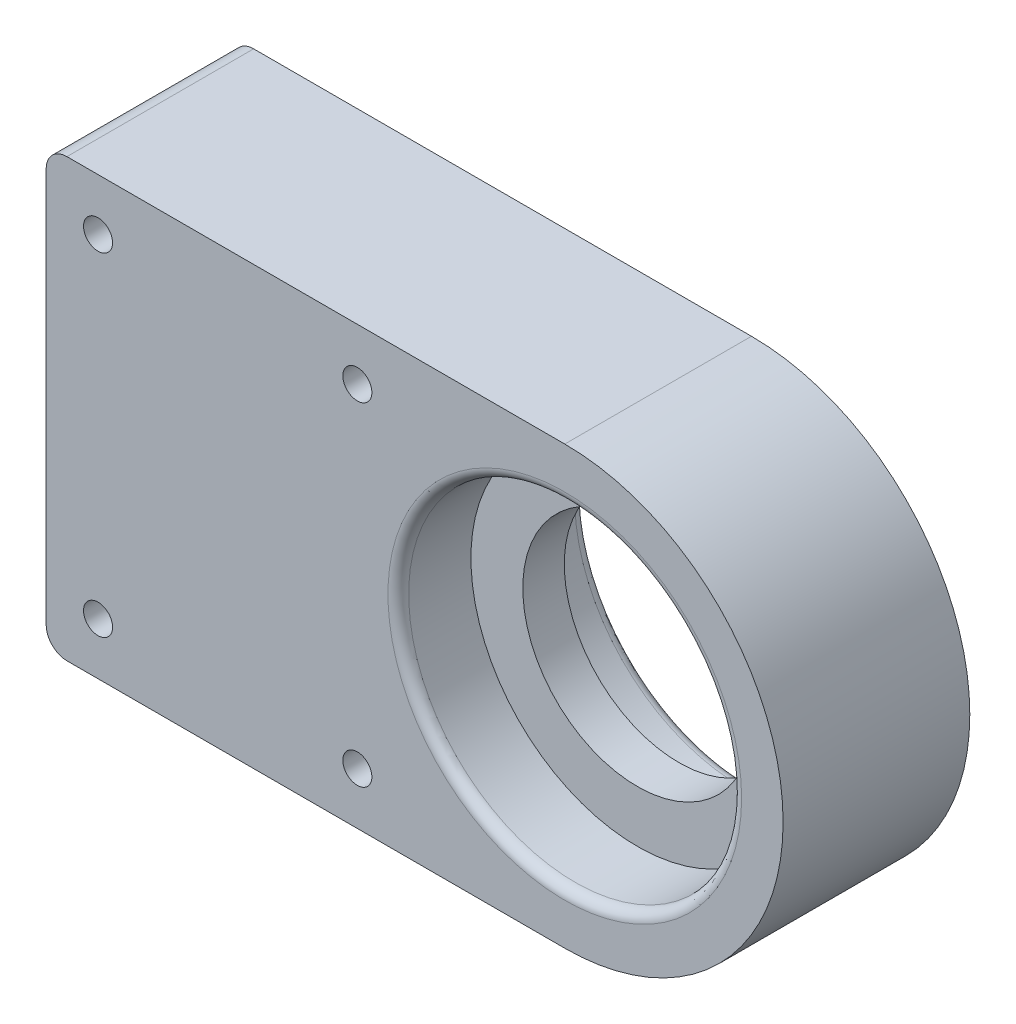
ISO-10303-21;
HEADER;
FILE_DESCRIPTION(('STEP AP214'),'2;1');
FILE_NAME('part.step','',(''),(''),'','','');
FILE_SCHEMA(('AUTOMOTIVE_DESIGN { 1 0 10303 214 1 1 1 1 }'));
ENDSEC;
DATA;
#1=APPLICATION_CONTEXT('core data for automotive mechanical design processes');
#2=APPLICATION_PROTOCOL_DEFINITION('international standard','automotive_design',2000,#1);
#3=PRODUCT_CONTEXT('',#1,'mechanical');
#4=PRODUCT('Part','Part','',(#3));
#5=PRODUCT_RELATED_PRODUCT_CATEGORY('part','',(#4));
#6=PRODUCT_DEFINITION_FORMATION('','',#4);
#7=PRODUCT_DEFINITION_CONTEXT('part definition',#1,'design');
#8=PRODUCT_DEFINITION('design','',#6,#7);
#9=PRODUCT_DEFINITION_SHAPE('','',#8);
#10=(LENGTH_UNIT() NAMED_UNIT(*) SI_UNIT(.MILLI.,.METRE.));
#11=(NAMED_UNIT(*) PLANE_ANGLE_UNIT() SI_UNIT($,.RADIAN.));
#12=(NAMED_UNIT(*) SI_UNIT($,.STERADIAN.) SOLID_ANGLE_UNIT());
#13=UNCERTAINTY_MEASURE_WITH_UNIT(LENGTH_MEASURE(1.E-05),#10,'distance_accuracy_value','');
#14=(GEOMETRIC_REPRESENTATION_CONTEXT(3) GLOBAL_UNCERTAINTY_ASSIGNED_CONTEXT((#13)) GLOBAL_UNIT_ASSIGNED_CONTEXT((#10,
#11,#12)) REPRESENTATION_CONTEXT('',''));
#15=CARTESIAN_POINT('',(0.,0.,0.));
#16=DIRECTION('',(0.,0.,1.));
#17=DIRECTION('',(1.,0.,0.));
#18=AXIS2_PLACEMENT_3D('',#15,#16,#17);
#19=CARTESIAN_POINT('',(0.,0.,-9.));
#20=DIRECTION('',(0.,0.,1.));
#21=DIRECTION('',(1.,0.,0.));
#22=AXIS2_PLACEMENT_3D('',#19,#20,#21);
#23=CYLINDRICAL_SURFACE('',#22,16.05);
#24=CARTESIAN_POINT('',(0.,0.,-8.));
#25=DIRECTION('',(0.,0.,1.));
#26=DIRECTION('',(1.,0.,0.));
#27=AXIS2_PLACEMENT_3D('',#24,#25,#26);
#28=CIRCLE('',#27,16.05);
#29=CARTESIAN_POINT('',(16.05,0.,-8.));
#30=VERTEX_POINT('',#29);
#31=EDGE_CURVE('E158',#30,#30,#28,.F.);
#32=ORIENTED_EDGE('',*,*,#31,.T.);
#33=EDGE_LOOP('',(#32));
#34=FACE_BOUND('',#33,.T.);
#35=CARTESIAN_POINT('',(0.,0.,-2.));
#36=DIRECTION('',(0.,0.,1.));
#37=DIRECTION('',(1.,0.,0.));
#38=AXIS2_PLACEMENT_3D('',#35,#36,#37);
#39=CIRCLE('',#38,16.05);
#40=CARTESIAN_POINT('',(16.05,0.,-2.));
#41=VERTEX_POINT('',#40);
#42=EDGE_CURVE('E137',#41,#41,#39,.F.);
#43=ORIENTED_EDGE('',*,*,#42,.F.);
#44=EDGE_LOOP('',(#43));
#45=FACE_BOUND('',#44,.T.);
#46=ADVANCED_FACE('F39',(#34,#45),#23,.F.);
#47=CARTESIAN_POINT('',(0.,0.,-9.));
#48=DIRECTION('',(0.,0.,1.));
#49=DIRECTION('',(1.,0.,0.));
#50=AXIS2_PLACEMENT_3D('',#47,#48,#49);
#51=CYLINDRICAL_SURFACE('',#50,21.05);
#52=CARTESIAN_POINT('',(0.,0.,9.));
#53=DIRECTION('',(0.,0.,1.));
#54=DIRECTION('',(1.,0.,0.));
#55=AXIS2_PLACEMENT_3D('',#52,#53,#54);
#56=CIRCLE('',#55,21.05);
#57=CARTESIAN_POINT('',(0.,-21.05,9.));
#58=VERTEX_POINT('',#57);
#59=CARTESIAN_POINT('',(0.,21.05,9.));
#60=VERTEX_POINT('',#59);
#61=EDGE_CURVE('E100',#58,#60,#56,.T.);
#62=ORIENTED_EDGE('',*,*,#61,.F.);
#63=DIRECTION('',(0.,0.,1.));
#64=VECTOR('',#63,1.);
#65=CARTESIAN_POINT('',(0.,-21.05,-9.));
#66=LINE('',#65,#64);
#67=CARTESIAN_POINT('',(0.,-21.05,-9.));
#68=VERTEX_POINT('',#67);
#69=EDGE_CURVE('E104',#68,#58,#66,.T.);
#70=ORIENTED_EDGE('',*,*,#69,.F.);
#71=CARTESIAN_POINT('',(0.,0.,-9.));
#72=DIRECTION('',(0.,0.,1.));
#73=DIRECTION('',(1.,0.,0.));
#74=AXIS2_PLACEMENT_3D('',#71,#72,#73);
#75=CIRCLE('',#74,21.05);
#76=CARTESIAN_POINT('',(0.,21.05,-9.));
#77=VERTEX_POINT('',#76);
#78=EDGE_CURVE('E102',#68,#77,#75,.T.);
#79=ORIENTED_EDGE('',*,*,#78,.T.);
#80=DIRECTION('',(0.,0.,1.));
#81=VECTOR('',#80,1.);
#82=CARTESIAN_POINT('',(0.,21.05,-9.));
#83=LINE('',#82,#81);
#84=EDGE_CURVE('E95',#77,#60,#83,.T.);
#85=ORIENTED_EDGE('',*,*,#84,.T.);
#86=EDGE_LOOP('',(#62,#70,#79,#85));
#87=FACE_BOUND('',#86,.T.);
#88=ADVANCED_FACE('F97',(#87),#51,.T.);
#89=CARTESIAN_POINT('',(-50.,-21.05,-9.));
#90=DIRECTION('',(0.,-1.,0.));
#91=DIRECTION('',(1.,0.,0.));
#92=AXIS2_PLACEMENT_3D('',#89,#90,#91);
#93=PLANE('',#92);
#94=DIRECTION('',(1.,0.,0.));
#95=VECTOR('',#94,1.);
#96=CARTESIAN_POINT('',(-50.,-21.05,9.));
#97=LINE('',#96,#95);
#98=CARTESIAN_POINT('',(-48.,-21.05,9.));
#99=VERTEX_POINT('',#98);
#100=EDGE_CURVE('E118',#99,#58,#97,.T.);
#101=ORIENTED_EDGE('',*,*,#100,.F.);
#102=DIRECTION('',(0.,0.,1.));
#103=VECTOR('',#102,1.);
#104=CARTESIAN_POINT('',(-48.,-21.05,-9.));
#105=LINE('',#104,#103);
#106=CARTESIAN_POINT('',(-48.,-21.05,-9.));
#107=VERTEX_POINT('',#106);
#108=EDGE_CURVE('E62',#99,#107,#105,.F.);
#109=ORIENTED_EDGE('',*,*,#108,.T.);
#110=DIRECTION('',(1.,0.,0.));
#111=VECTOR('',#110,1.);
#112=CARTESIAN_POINT('',(-50.,-21.05,-9.));
#113=LINE('',#112,#111);
#114=EDGE_CURVE('E105',#107,#68,#113,.T.);
#115=ORIENTED_EDGE('',*,*,#114,.T.);
#116=ORIENTED_EDGE('',*,*,#69,.T.);
#117=EDGE_LOOP('',(#101,#109,#115,#116));
#118=FACE_BOUND('',#117,.T.);
#119=ADVANCED_FACE('F183',(#118),#93,.T.);
#120=CARTESIAN_POINT('',(-50.,21.05,-9.));
#121=DIRECTION('',(-1.,0.,0.));
#122=DIRECTION('',(0.,0.,1.));
#123=AXIS2_PLACEMENT_3D('',#120,#121,#122);
#124=PLANE('',#123);
#125=DIRECTION('',(0.,-1.,0.));
#126=VECTOR('',#125,1.);
#127=CARTESIAN_POINT('',(-50.,21.05,-9.));
#128=LINE('',#127,#126);
#129=CARTESIAN_POINT('',(-50.,19.05,-9.));
#130=VERTEX_POINT('',#129);
#131=CARTESIAN_POINT('',(-50.,-19.05,-9.));
#132=VERTEX_POINT('',#131);
#133=EDGE_CURVE('E133',#130,#132,#128,.T.);
#134=ORIENTED_EDGE('',*,*,#133,.T.);
#135=DIRECTION('',(0.,0.,1.));
#136=VECTOR('',#135,1.);
#137=CARTESIAN_POINT('',(-50.,-19.05,-9.));
#138=LINE('',#137,#136);
#139=CARTESIAN_POINT('',(-50.,-19.05,9.));
#140=VERTEX_POINT('',#139);
#141=EDGE_CURVE('E143',#132,#140,#138,.T.);
#142=ORIENTED_EDGE('',*,*,#141,.T.);
#143=DIRECTION('',(0.,-1.,0.));
#144=VECTOR('',#143,1.);
#145=CARTESIAN_POINT('',(-50.,21.05,9.));
#146=LINE('',#145,#144);
#147=CARTESIAN_POINT('',(-50.,19.05,9.));
#148=VERTEX_POINT('',#147);
#149=EDGE_CURVE('E114',#148,#140,#146,.T.);
#150=ORIENTED_EDGE('',*,*,#149,.F.);
#151=DIRECTION('',(0.,0.,1.));
#152=VECTOR('',#151,1.);
#153=CARTESIAN_POINT('',(-50.,19.05,-9.));
#154=LINE('',#153,#152);
#155=EDGE_CURVE('E140',#148,#130,#154,.F.);
#156=ORIENTED_EDGE('',*,*,#155,.T.);
#157=EDGE_LOOP('',(#134,#142,#150,#156));
#158=FACE_BOUND('',#157,.T.);
#159=ADVANCED_FACE('F199',(#158),#124,.T.);
#160=CARTESIAN_POINT('',(0.,21.05,-9.));
#161=DIRECTION('',(0.,1.,0.));
#162=DIRECTION('',(-1.,0.,0.));
#163=AXIS2_PLACEMENT_3D('',#160,#161,#162);
#164=PLANE('',#163);
#165=DIRECTION('',(-1.,0.,0.));
#166=VECTOR('',#165,1.);
#167=CARTESIAN_POINT('',(0.,21.05,-9.));
#168=LINE('',#167,#166);
#169=CARTESIAN_POINT('',(-48.,21.05,-9.));
#170=VERTEX_POINT('',#169);
#171=EDGE_CURVE('E131',#77,#170,#168,.T.);
#172=ORIENTED_EDGE('',*,*,#171,.T.);
#173=DIRECTION('',(0.,0.,1.));
#174=VECTOR('',#173,1.);
#175=CARTESIAN_POINT('',(-48.,21.05,-9.));
#176=LINE('',#175,#174);
#177=CARTESIAN_POINT('',(-48.,21.05,9.));
#178=VERTEX_POINT('',#177);
#179=EDGE_CURVE('E112',#170,#178,#176,.T.);
#180=ORIENTED_EDGE('',*,*,#179,.T.);
#181=DIRECTION('',(-1.,0.,0.));
#182=VECTOR('',#181,1.);
#183=CARTESIAN_POINT('',(0.,21.05,9.));
#184=LINE('',#183,#182);
#185=EDGE_CURVE('E109',#60,#178,#184,.T.);
#186=ORIENTED_EDGE('',*,*,#185,.F.);
#187=ORIENTED_EDGE('',*,*,#84,.F.);
#188=EDGE_LOOP('',(#172,#180,#186,#187));
#189=FACE_BOUND('',#188,.T.);
#190=ADVANCED_FACE('F110',(#189),#164,.T.);
#191=CARTESIAN_POINT('',(0.,0.,-9.));
#192=DIRECTION('',(0.,0.,1.));
#193=DIRECTION('',(1.,0.,0.));
#194=AXIS2_PLACEMENT_3D('',#191,#192,#193);
#195=PLANE('',#194);
#196=CARTESIAN_POINT('',(0.,0.,-9.));
#197=DIRECTION('',(0.,0.,1.));
#198=DIRECTION('',(1.,0.,0.));
#199=AXIS2_PLACEMENT_3D('',#196,#197,#198);
#200=CIRCLE('',#199,17.05);
#201=CARTESIAN_POINT('',(17.05,0.,-9.));
#202=VERTEX_POINT('',#201);
#203=EDGE_CURVE('E155',#202,#202,#200,.T.);
#204=ORIENTED_EDGE('',*,*,#203,.T.);
#205=EDGE_LOOP('',(#204));
#206=FACE_BOUND('',#205,.T.);
#207=CARTESIAN_POINT('',(-45.,-16.05,-9.));
#208=DIRECTION('',(0.,0.,1.));
#209=DIRECTION('',(1.,0.,0.));
#210=AXIS2_PLACEMENT_3D('',#207,#208,#209);
#211=CIRCLE('',#210,1.4);
#212=CARTESIAN_POINT('',(-43.6,-16.05,-9.));
#213=VERTEX_POINT('',#212);
#214=EDGE_CURVE('E403',#213,#213,#211,.T.);
#215=ORIENTED_EDGE('',*,*,#214,.T.);
#216=EDGE_LOOP('',(#215));
#217=FACE_BOUND('',#216,.T.);
#218=CARTESIAN_POINT('',(-20.,-16.05,-9.));
#219=DIRECTION('',(0.,0.,1.));
#220=DIRECTION('',(1.,0.,0.));
#221=AXIS2_PLACEMENT_3D('',#218,#219,#220);
#222=CIRCLE('',#221,1.4);
#223=CARTESIAN_POINT('',(-18.6,-16.05,-9.));
#224=VERTEX_POINT('',#223);
#225=EDGE_CURVE('E409',#224,#224,#222,.T.);
#226=ORIENTED_EDGE('',*,*,#225,.T.);
#227=EDGE_LOOP('',(#226));
#228=FACE_BOUND('',#227,.T.);
#229=CARTESIAN_POINT('',(-20.,16.05,-9.));
#230=DIRECTION('',(0.,0.,1.));
#231=DIRECTION('',(1.,0.,0.));
#232=AXIS2_PLACEMENT_3D('',#229,#230,#231);
#233=CIRCLE('',#232,1.4);
#234=CARTESIAN_POINT('',(-18.6,16.05,-9.));
#235=VERTEX_POINT('',#234);
#236=EDGE_CURVE('E415',#235,#235,#233,.T.);
#237=ORIENTED_EDGE('',*,*,#236,.T.);
#238=EDGE_LOOP('',(#237));
#239=FACE_BOUND('',#238,.T.);
#240=CARTESIAN_POINT('',(-45.,16.05,-9.));
#241=DIRECTION('',(0.,0.,1.));
#242=DIRECTION('',(1.,0.,0.));
#243=AXIS2_PLACEMENT_3D('',#240,#241,#242);
#244=CIRCLE('',#243,1.4);
#245=CARTESIAN_POINT('',(-43.6,16.05,-9.));
#246=VERTEX_POINT('',#245);
#247=EDGE_CURVE('E394',#246,#246,#244,.T.);
#248=ORIENTED_EDGE('',*,*,#247,.T.);
#249=EDGE_LOOP('',(#248));
#250=FACE_BOUND('',#249,.T.);
#251=ORIENTED_EDGE('',*,*,#114,.F.);
#252=CARTESIAN_POINT('',(-48.,-19.05,-9.));
#253=DIRECTION('',(0.,0.,1.));
#254=DIRECTION('',(1.,0.,0.));
#255=AXIS2_PLACEMENT_3D('',#252,#253,#254);
#256=CIRCLE('',#255,2.);
#257=EDGE_CURVE('E152',#107,#132,#256,.F.);
#258=ORIENTED_EDGE('',*,*,#257,.T.);
#259=ORIENTED_EDGE('',*,*,#133,.F.);
#260=CARTESIAN_POINT('',(-48.,19.05,-9.));
#261=DIRECTION('',(0.,0.,1.));
#262=DIRECTION('',(1.,0.,0.));
#263=AXIS2_PLACEMENT_3D('',#260,#261,#262);
#264=CIRCLE('',#263,2.);
#265=EDGE_CURVE('E54',#130,#170,#264,.F.);
#266=ORIENTED_EDGE('',*,*,#265,.T.);
#267=ORIENTED_EDGE('',*,*,#171,.F.);
#268=ORIENTED_EDGE('',*,*,#78,.F.);
#269=EDGE_LOOP('',(#251,#258,#259,#266,#267,#268));
#270=FACE_BOUND('',#269,.T.);
#271=ADVANCED_FACE('F189',(#206,#217,#228,#239,#250,#270),#195,.F.);
#272=CARTESIAN_POINT('',(0.,0.,8.));
#273=DIRECTION('',(0.,0.,1.));
#274=DIRECTION('',(1.,0.,0.));
#275=AXIS2_PLACEMENT_3D('',#272,#273,#274);
#276=CIRCLE('',#275,16.05);
#277=CARTESIAN_POINT('',(16.05,0.,8.));
#278=VERTEX_POINT('',#277);
#279=EDGE_CURVE('E47',#278,#278,#276,.T.);
#280=ORIENTED_EDGE('',*,*,#279,.T.);
#281=EDGE_LOOP('',(#280));
#282=FACE_BOUND('',#281,.T.);
#283=CARTESIAN_POINT('',(0.,0.,2.));
#284=DIRECTION('',(0.,0.,1.));
#285=DIRECTION('',(1.,0.,0.));
#286=AXIS2_PLACEMENT_3D('',#283,#284,#285);
#287=CIRCLE('',#286,16.05);
#288=CARTESIAN_POINT('',(16.05,0.,2.));
#289=VERTEX_POINT('',#288);
#290=EDGE_CURVE('E120',#289,#289,#287,.F.);
#291=ORIENTED_EDGE('',*,*,#290,.T.);
#292=EDGE_LOOP('',(#291));
#293=FACE_BOUND('',#292,.T.);
#294=ADVANCED_FACE('F163',(#282,#293),#23,.F.);
#295=CARTESIAN_POINT('',(0.,0.,9.));
#296=DIRECTION('',(0.,0.,1.));
#297=DIRECTION('',(1.,0.,0.));
#298=AXIS2_PLACEMENT_3D('',#295,#296,#297);
#299=PLANE('',#298);
#300=CARTESIAN_POINT('',(0.,0.,9.));
#301=DIRECTION('',(0.,0.,1.));
#302=DIRECTION('',(1.,0.,0.));
#303=AXIS2_PLACEMENT_3D('',#300,#301,#302);
#304=CIRCLE('',#303,17.05);
#305=CARTESIAN_POINT('',(17.05,0.,9.));
#306=VERTEX_POINT('',#305);
#307=EDGE_CURVE('E12',#306,#306,#304,.F.);
#308=ORIENTED_EDGE('',*,*,#307,.T.);
#309=EDGE_LOOP('',(#308));
#310=FACE_BOUND('',#309,.T.);
#311=CARTESIAN_POINT('',(-45.,-16.05,9.));
#312=DIRECTION('',(0.,0.,1.));
#313=DIRECTION('',(1.,0.,0.));
#314=AXIS2_PLACEMENT_3D('',#311,#312,#313);
#315=CIRCLE('',#314,1.4);
#316=CARTESIAN_POINT('',(-43.6,-16.05,9.));
#317=VERTEX_POINT('',#316);
#318=EDGE_CURVE('E406',#317,#317,#315,.T.);
#319=ORIENTED_EDGE('',*,*,#318,.F.);
#320=EDGE_LOOP('',(#319));
#321=FACE_BOUND('',#320,.T.);
#322=CARTESIAN_POINT('',(-20.,-16.05,9.));
#323=DIRECTION('',(0.,0.,1.));
#324=DIRECTION('',(1.,0.,0.));
#325=AXIS2_PLACEMENT_3D('',#322,#323,#324);
#326=CIRCLE('',#325,1.4);
#327=CARTESIAN_POINT('',(-18.6,-16.05,9.));
#328=VERTEX_POINT('',#327);
#329=EDGE_CURVE('E412',#328,#328,#326,.T.);
#330=ORIENTED_EDGE('',*,*,#329,.F.);
#331=EDGE_LOOP('',(#330));
#332=FACE_BOUND('',#331,.T.);
#333=CARTESIAN_POINT('',(-20.,16.05,9.));
#334=DIRECTION('',(0.,0.,1.));
#335=DIRECTION('',(1.,0.,0.));
#336=AXIS2_PLACEMENT_3D('',#333,#334,#335);
#337=CIRCLE('',#336,1.4);
#338=CARTESIAN_POINT('',(-18.6,16.05,9.));
#339=VERTEX_POINT('',#338);
#340=EDGE_CURVE('E401',#339,#339,#337,.T.);
#341=ORIENTED_EDGE('',*,*,#340,.F.);
#342=EDGE_LOOP('',(#341));
#343=FACE_BOUND('',#342,.T.);
#344=CARTESIAN_POINT('',(-45.,16.05,9.));
#345=DIRECTION('',(0.,0.,1.));
#346=DIRECTION('',(1.,0.,0.));
#347=AXIS2_PLACEMENT_3D('',#344,#345,#346);
#348=CIRCLE('',#347,1.4);
#349=CARTESIAN_POINT('',(-43.6,16.05,9.));
#350=VERTEX_POINT('',#349);
#351=EDGE_CURVE('E397',#350,#350,#348,.T.);
#352=ORIENTED_EDGE('',*,*,#351,.F.);
#353=EDGE_LOOP('',(#352));
#354=FACE_BOUND('',#353,.T.);
#355=ORIENTED_EDGE('',*,*,#149,.T.);
#356=CARTESIAN_POINT('',(-48.,-19.05,9.));
#357=DIRECTION('',(0.,0.,1.));
#358=DIRECTION('',(1.,0.,0.));
#359=AXIS2_PLACEMENT_3D('',#356,#357,#358);
#360=CIRCLE('',#359,2.);
#361=EDGE_CURVE('E148',#140,#99,#360,.T.);
#362=ORIENTED_EDGE('',*,*,#361,.T.);
#363=ORIENTED_EDGE('',*,*,#100,.T.);
#364=ORIENTED_EDGE('',*,*,#61,.T.);
#365=ORIENTED_EDGE('',*,*,#185,.T.);
#366=CARTESIAN_POINT('',(-48.,19.05,9.));
#367=DIRECTION('',(0.,0.,1.));
#368=DIRECTION('',(1.,0.,0.));
#369=AXIS2_PLACEMENT_3D('',#366,#367,#368);
#370=CIRCLE('',#369,2.);
#371=EDGE_CURVE('E146',#178,#148,#370,.T.);
#372=ORIENTED_EDGE('',*,*,#371,.T.);
#373=EDGE_LOOP('',(#355,#362,#363,#364,#365,#372));
#374=FACE_BOUND('',#373,.T.);
#375=ADVANCED_FACE('F117',(#310,#321,#332,#343,#354,#374),#299,.T.);
#376=CARTESIAN_POINT('',(0.,0.,2.));
#377=DIRECTION('',(0.,0.,1.));
#378=DIRECTION('',(1.,0.,0.));
#379=AXIS2_PLACEMENT_3D('',#376,#377,#378);
#380=PLANE('',#379);
#381=CARTESIAN_POINT('',(0.,0.,2.));
#382=DIRECTION('',(0.,0.,1.));
#383=DIRECTION('',(1.,0.,0.));
#384=AXIS2_PLACEMENT_3D('',#381,#382,#383);
#385=CIRCLE('',#384,11.05);
#386=CARTESIAN_POINT('',(11.05,0.,2.));
#387=VERTEX_POINT('',#386);
#388=EDGE_CURVE('E123',#387,#387,#385,.F.);
#389=ORIENTED_EDGE('',*,*,#388,.T.);
#390=EDGE_LOOP('',(#389));
#391=FACE_BOUND('',#390,.T.);
#392=ORIENTED_EDGE('',*,*,#290,.F.);
#393=EDGE_LOOP('',(#392));
#394=FACE_BOUND('',#393,.T.);
#395=ADVANCED_FACE('F193',(#391,#394),#380,.T.);
#396=CARTESIAN_POINT('',(0.,0.,-2.));
#397=DIRECTION('',(0.,0.,1.));
#398=DIRECTION('',(1.,0.,0.));
#399=AXIS2_PLACEMENT_3D('',#396,#397,#398);
#400=PLANE('',#399);
#401=CARTESIAN_POINT('',(0.,0.,-2.));
#402=DIRECTION('',(0.,0.,1.));
#403=DIRECTION('',(1.,0.,0.));
#404=AXIS2_PLACEMENT_3D('',#401,#402,#403);
#405=CIRCLE('',#404,11.05);
#406=CARTESIAN_POINT('',(11.05,0.,-2.));
#407=VERTEX_POINT('',#406);
#408=EDGE_CURVE('E392',#407,#407,#405,.T.);
#409=ORIENTED_EDGE('',*,*,#408,.T.);
#410=EDGE_LOOP('',(#409));
#411=FACE_BOUND('',#410,.T.);
#412=ORIENTED_EDGE('',*,*,#42,.T.);
#413=EDGE_LOOP('',(#412));
#414=FACE_BOUND('',#413,.T.);
#415=ADVANCED_FACE('F294',(#411,#414),#400,.F.);
#416=CARTESIAN_POINT('',(0.,0.,91.5863941578757));
#417=DIRECTION('',(0.,0.,-1.));
#418=DIRECTION('',(-1.,0.,0.));
#419=AXIS2_PLACEMENT_3D('',#416,#417,#418);
#420=CYLINDRICAL_SURFACE('',#419,11.05);
#421=ORIENTED_EDGE('',*,*,#388,.F.);
#422=EDGE_LOOP('',(#421));
#423=FACE_BOUND('',#422,.T.);
#424=ORIENTED_EDGE('',*,*,#408,.F.);
#425=EDGE_LOOP('',(#424));
#426=FACE_BOUND('',#425,.T.);
#427=ADVANCED_FACE('F284',(#423,#426),#420,.F.);
#428=CARTESIAN_POINT('',(-45.,16.05,-9.));
#429=DIRECTION('',(0.,0.,1.));
#430=DIRECTION('',(1.,0.,0.));
#431=AXIS2_PLACEMENT_3D('',#428,#429,#430);
#432=CYLINDRICAL_SURFACE('',#431,1.4);
#433=ORIENTED_EDGE('',*,*,#247,.F.);
#434=EDGE_LOOP('',(#433));
#435=FACE_BOUND('',#434,.T.);
#436=ORIENTED_EDGE('',*,*,#351,.T.);
#437=EDGE_LOOP('',(#436));
#438=FACE_BOUND('',#437,.T.);
#439=ADVANCED_FACE('F274',(#435,#438),#432,.F.);
#440=CARTESIAN_POINT('',(-20.,16.05,-9.));
#441=DIRECTION('',(0.,0.,1.));
#442=DIRECTION('',(1.,0.,0.));
#443=AXIS2_PLACEMENT_3D('',#440,#441,#442);
#444=CYLINDRICAL_SURFACE('',#443,1.4);
#445=ORIENTED_EDGE('',*,*,#236,.F.);
#446=EDGE_LOOP('',(#445));
#447=FACE_BOUND('',#446,.T.);
#448=ORIENTED_EDGE('',*,*,#340,.T.);
#449=EDGE_LOOP('',(#448));
#450=FACE_BOUND('',#449,.T.);
#451=ADVANCED_FACE('F264',(#447,#450),#444,.F.);
#452=CARTESIAN_POINT('',(-20.,-16.05,-9.));
#453=DIRECTION('',(0.,0.,1.));
#454=DIRECTION('',(1.,0.,0.));
#455=AXIS2_PLACEMENT_3D('',#452,#453,#454);
#456=CYLINDRICAL_SURFACE('',#455,1.4);
#457=ORIENTED_EDGE('',*,*,#225,.F.);
#458=EDGE_LOOP('',(#457));
#459=FACE_BOUND('',#458,.T.);
#460=ORIENTED_EDGE('',*,*,#329,.T.);
#461=EDGE_LOOP('',(#460));
#462=FACE_BOUND('',#461,.T.);
#463=ADVANCED_FACE('F254',(#459,#462),#456,.F.);
#464=CARTESIAN_POINT('',(-45.,-16.05,-9.));
#465=DIRECTION('',(0.,0.,1.));
#466=DIRECTION('',(1.,0.,0.));
#467=AXIS2_PLACEMENT_3D('',#464,#465,#466);
#468=CYLINDRICAL_SURFACE('',#467,1.4);
#469=ORIENTED_EDGE('',*,*,#214,.F.);
#470=EDGE_LOOP('',(#469));
#471=FACE_BOUND('',#470,.T.);
#472=ORIENTED_EDGE('',*,*,#318,.T.);
#473=EDGE_LOOP('',(#472));
#474=FACE_BOUND('',#473,.T.);
#475=ADVANCED_FACE('F211',(#471,#474),#468,.F.);
#476=CARTESIAN_POINT('',(-48.,-19.05,-9.));
#477=DIRECTION('',(0.,0.,1.));
#478=DIRECTION('',(1.,0.,0.));
#479=AXIS2_PLACEMENT_3D('',#476,#477,#478);
#480=CYLINDRICAL_SURFACE('',#479,2.);
#481=ORIENTED_EDGE('',*,*,#257,.F.);
#482=ORIENTED_EDGE('',*,*,#108,.F.);
#483=ORIENTED_EDGE('',*,*,#361,.F.);
#484=ORIENTED_EDGE('',*,*,#141,.F.);
#485=EDGE_LOOP('',(#481,#482,#483,#484));
#486=FACE_BOUND('',#485,.T.);
#487=ADVANCED_FACE('F208',(#486),#480,.T.);
#488=CARTESIAN_POINT('',(-48.,19.05,-9.));
#489=DIRECTION('',(0.,0.,1.));
#490=DIRECTION('',(1.,0.,0.));
#491=AXIS2_PLACEMENT_3D('',#488,#489,#490);
#492=CYLINDRICAL_SURFACE('',#491,2.);
#493=ORIENTED_EDGE('',*,*,#265,.F.);
#494=ORIENTED_EDGE('',*,*,#155,.F.);
#495=ORIENTED_EDGE('',*,*,#371,.F.);
#496=ORIENTED_EDGE('',*,*,#179,.F.);
#497=EDGE_LOOP('',(#493,#494,#495,#496));
#498=FACE_BOUND('',#497,.T.);
#499=ADVANCED_FACE('F172',(#498),#492,.T.);
#500=CARTESIAN_POINT('',(0.,0.,-8.));
#501=DIRECTION('',(0.,0.,1.));
#502=DIRECTION('',(1.,0.,0.));
#503=AXIS2_PLACEMENT_3D('',#500,#501,#502);
#504=TOROIDAL_SURFACE('',#503,17.05,1.);
#505=ORIENTED_EDGE('',*,*,#31,.F.);
#506=EDGE_LOOP('',(#505));
#507=FACE_BOUND('',#506,.T.);
#508=ORIENTED_EDGE('',*,*,#203,.F.);
#509=EDGE_LOOP('',(#508));
#510=FACE_BOUND('',#509,.T.);
#511=ADVANCED_FACE('F167',(#507,#510),#504,.T.);
#512=CARTESIAN_POINT('',(0.,0.,8.));
#513=DIRECTION('',(0.,0.,1.));
#514=DIRECTION('',(1.,0.,0.));
#515=AXIS2_PLACEMENT_3D('',#512,#513,#514);
#516=TOROIDAL_SURFACE('',#515,17.05,1.);
#517=ORIENTED_EDGE('',*,*,#307,.F.);
#518=EDGE_LOOP('',(#517));
#519=FACE_BOUND('',#518,.T.);
#520=ORIENTED_EDGE('',*,*,#279,.F.);
#521=EDGE_LOOP('',(#520));
#522=FACE_BOUND('',#521,.T.);
#523=ADVANCED_FACE('F41',(#519,#522),#516,.T.);
#524=CLOSED_SHELL('',(#46,#88,#119,#159,#190,#271,#294,#375,#395,#415,#427,#439,#451,#463,#475,
#487,#499,#511,#523));
#525=MANIFOLD_SOLID_BREP('B2',#524);
#526=ADVANCED_BREP_SHAPE_REPRESENTATION('',(#18,#525),#14);
#527=SHAPE_DEFINITION_REPRESENTATION(#9,#526);
ENDSEC;
END-ISO-10303-21;
